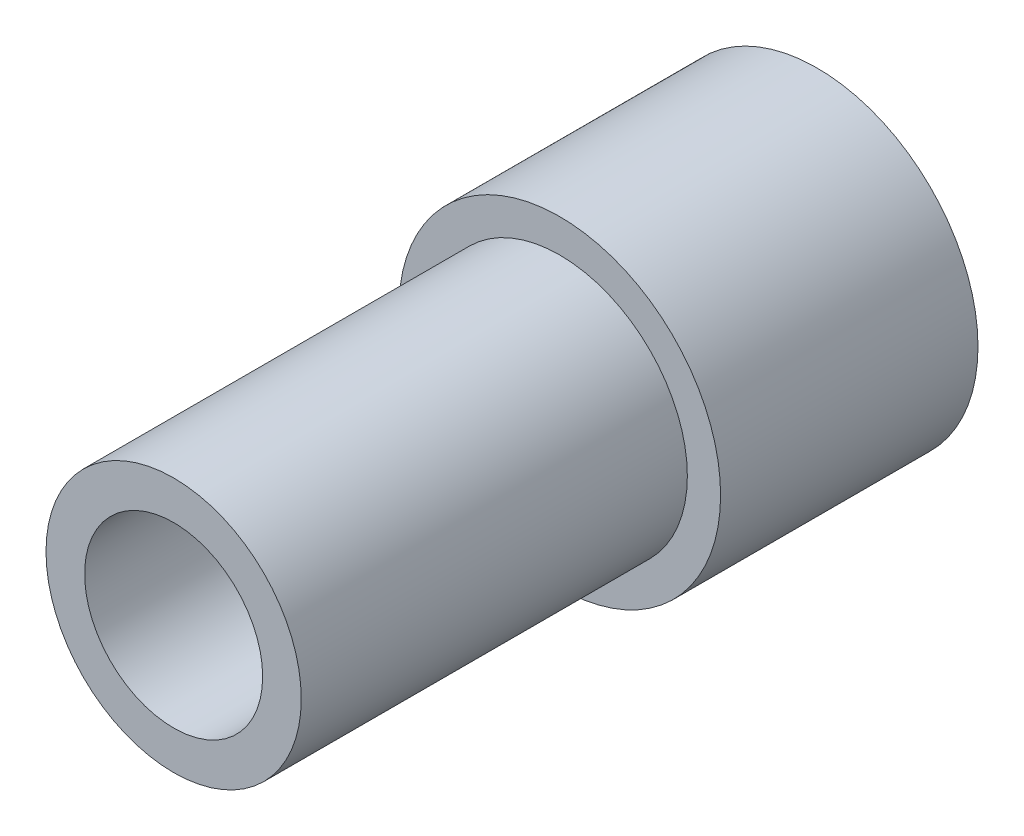
ISO-10303-21;
HEADER;
FILE_DESCRIPTION(('STEP AP214'),'2;1');
FILE_NAME('part.step','',(''),(''),'','','');
FILE_SCHEMA(('AUTOMOTIVE_DESIGN { 1 0 10303 214 1 1 1 1 }'));
ENDSEC;
DATA;
#1=APPLICATION_CONTEXT('core data for automotive mechanical design processes');
#2=APPLICATION_PROTOCOL_DEFINITION('international standard','automotive_design',2000,#1);
#3=PRODUCT_CONTEXT('',#1,'mechanical');
#4=PRODUCT('Part','Part','',(#3));
#5=PRODUCT_RELATED_PRODUCT_CATEGORY('part','',(#4));
#6=PRODUCT_DEFINITION_FORMATION('','',#4);
#7=PRODUCT_DEFINITION_CONTEXT('part definition',#1,'design');
#8=PRODUCT_DEFINITION('design','',#6,#7);
#9=PRODUCT_DEFINITION_SHAPE('','',#8);
#10=(LENGTH_UNIT() NAMED_UNIT(*) SI_UNIT(.MILLI.,.METRE.));
#11=(NAMED_UNIT(*) PLANE_ANGLE_UNIT() SI_UNIT($,.RADIAN.));
#12=(NAMED_UNIT(*) SI_UNIT($,.STERADIAN.) SOLID_ANGLE_UNIT());
#13=UNCERTAINTY_MEASURE_WITH_UNIT(LENGTH_MEASURE(1.E-05),#10,'distance_accuracy_value','');
#14=(GEOMETRIC_REPRESENTATION_CONTEXT(3) GLOBAL_UNCERTAINTY_ASSIGNED_CONTEXT((#13)) GLOBAL_UNIT_ASSIGNED_CONTEXT((#10,
#11,#12)) REPRESENTATION_CONTEXT('',''));
#15=CARTESIAN_POINT('',(0.,0.,0.));
#16=DIRECTION('',(0.,0.,1.));
#17=DIRECTION('',(1.,0.,0.));
#18=AXIS2_PLACEMENT_3D('',#15,#16,#17);
#19=CARTESIAN_POINT('',(0.,0.,30.));
#20=DIRECTION('',(0.,0.,1.));
#21=DIRECTION('',(1.,0.,0.));
#22=AXIS2_PLACEMENT_3D('',#19,#20,#21);
#23=PLANE('',#22);
#24=CARTESIAN_POINT('',(0.,0.,30.));
#25=DIRECTION('',(0.,0.,1.));
#26=DIRECTION('',(1.,0.,0.));
#27=AXIS2_PLACEMENT_3D('',#24,#25,#26);
#28=CIRCLE('',#27,4.15);
#29=CARTESIAN_POINT('',(4.15,0.,30.));
#30=VERTEX_POINT('',#29);
#31=EDGE_CURVE('E38',#30,#30,#28,.T.);
#32=ORIENTED_EDGE('',*,*,#31,.F.);
#33=EDGE_LOOP('',(#32));
#34=FACE_BOUND('',#33,.T.);
#35=CARTESIAN_POINT('',(0.,0.,30.));
#36=DIRECTION('',(0.,0.,1.));
#37=DIRECTION('',(1.,0.,0.));
#38=AXIS2_PLACEMENT_3D('',#35,#36,#37);
#39=CIRCLE('',#38,5.95);
#40=CARTESIAN_POINT('',(5.95,0.,30.));
#41=VERTEX_POINT('',#40);
#42=EDGE_CURVE('E52',#41,#41,#39,.T.);
#43=ORIENTED_EDGE('',*,*,#42,.T.);
#44=EDGE_LOOP('',(#43));
#45=FACE_BOUND('',#44,.T.);
#46=ADVANCED_FACE('F31',(#34,#45),#23,.T.);
#47=CARTESIAN_POINT('',(0.,0.,30.));
#48=DIRECTION('',(0.,0.,-1.));
#49=DIRECTION('',(-1.,0.,0.));
#50=AXIS2_PLACEMENT_3D('',#47,#48,#49);
#51=CYLINDRICAL_SURFACE('',#50,7.5);
#52=CARTESIAN_POINT('',(0.,0.,0.));
#53=DIRECTION('',(0.,0.,1.));
#54=DIRECTION('',(1.,0.,0.));
#55=AXIS2_PLACEMENT_3D('',#52,#53,#54);
#56=CIRCLE('',#55,7.5);
#57=CARTESIAN_POINT('',(7.5,0.,0.));
#58=VERTEX_POINT('',#57);
#59=EDGE_CURVE('E10',#58,#58,#56,.T.);
#60=ORIENTED_EDGE('',*,*,#59,.T.);
#61=EDGE_LOOP('',(#60));
#62=FACE_BOUND('',#61,.T.);
#63=CARTESIAN_POINT('',(0.,0.,12.));
#64=DIRECTION('',(0.,0.,1.));
#65=DIRECTION('',(1.,0.,0.));
#66=AXIS2_PLACEMENT_3D('',#63,#64,#65);
#67=CIRCLE('',#66,7.5);
#68=CARTESIAN_POINT('',(7.5,0.,12.));
#69=VERTEX_POINT('',#68);
#70=EDGE_CURVE('E47',#69,#69,#67,.T.);
#71=ORIENTED_EDGE('',*,*,#70,.F.);
#72=EDGE_LOOP('',(#71));
#73=FACE_BOUND('',#72,.T.);
#74=ADVANCED_FACE('F33',(#62,#73),#51,.T.);
#75=CARTESIAN_POINT('',(0.,0.,0.));
#76=DIRECTION('',(0.,0.,1.));
#77=DIRECTION('',(1.,0.,0.));
#78=AXIS2_PLACEMENT_3D('',#75,#76,#77);
#79=PLANE('',#78);
#80=ORIENTED_EDGE('',*,*,#59,.F.);
#81=EDGE_LOOP('',(#80));
#82=FACE_BOUND('',#81,.T.);
#83=CARTESIAN_POINT('',(0.,0.,0.));
#84=DIRECTION('',(0.,0.,1.));
#85=DIRECTION('',(1.,0.,0.));
#86=AXIS2_PLACEMENT_3D('',#83,#84,#85);
#87=CIRCLE('',#86,4.15);
#88=CARTESIAN_POINT('',(4.15,0.,0.));
#89=VERTEX_POINT('',#88);
#90=EDGE_CURVE('E42',#89,#89,#87,.T.);
#91=ORIENTED_EDGE('',*,*,#90,.T.);
#92=EDGE_LOOP('',(#91));
#93=FACE_BOUND('',#92,.T.);
#94=ADVANCED_FACE('F69',(#82,#93),#79,.F.);
#95=CARTESIAN_POINT('',(0.,0.,30.));
#96=DIRECTION('',(0.,0.,-1.));
#97=DIRECTION('',(-1.,0.,0.));
#98=AXIS2_PLACEMENT_3D('',#95,#96,#97);
#99=CYLINDRICAL_SURFACE('',#98,4.15);
#100=ORIENTED_EDGE('',*,*,#31,.T.);
#101=EDGE_LOOP('',(#100));
#102=FACE_BOUND('',#101,.T.);
#103=ORIENTED_EDGE('',*,*,#90,.F.);
#104=EDGE_LOOP('',(#103));
#105=FACE_BOUND('',#104,.T.);
#106=ADVANCED_FACE('F64',(#102,#105),#99,.F.);
#107=CARTESIAN_POINT('',(0.,0.,12.));
#108=DIRECTION('',(0.,0.,1.));
#109=DIRECTION('',(1.,0.,0.));
#110=AXIS2_PLACEMENT_3D('',#107,#108,#109);
#111=PLANE('',#110);
#112=CARTESIAN_POINT('',(0.,0.,12.));
#113=DIRECTION('',(0.,0.,1.));
#114=DIRECTION('',(1.,0.,0.));
#115=AXIS2_PLACEMENT_3D('',#112,#113,#114);
#116=CIRCLE('',#115,5.95);
#117=CARTESIAN_POINT('',(5.95,0.,12.));
#118=VERTEX_POINT('',#117);
#119=EDGE_CURVE('E51',#118,#118,#116,.T.);
#120=ORIENTED_EDGE('',*,*,#119,.F.);
#121=EDGE_LOOP('',(#120));
#122=FACE_BOUND('',#121,.T.);
#123=ORIENTED_EDGE('',*,*,#70,.T.);
#124=EDGE_LOOP('',(#123));
#125=FACE_BOUND('',#124,.T.);
#126=ADVANCED_FACE('F61',(#122,#125),#111,.T.);
#127=CARTESIAN_POINT('',(0.,0.,12.));
#128=DIRECTION('',(0.,0.,1.));
#129=DIRECTION('',(1.,0.,0.));
#130=AXIS2_PLACEMENT_3D('',#127,#128,#129);
#131=CYLINDRICAL_SURFACE('',#130,5.95);
#132=ORIENTED_EDGE('',*,*,#119,.T.);
#133=EDGE_LOOP('',(#132));
#134=FACE_BOUND('',#133,.T.);
#135=ORIENTED_EDGE('',*,*,#42,.F.);
#136=EDGE_LOOP('',(#135));
#137=FACE_BOUND('',#136,.T.);
#138=ADVANCED_FACE('F58',(#134,#137),#131,.T.);
#139=CLOSED_SHELL('',(#46,#74,#94,#106,#126,#138));
#140=MANIFOLD_SOLID_BREP('B2',#139);
#141=ADVANCED_BREP_SHAPE_REPRESENTATION('',(#18,#140),#14);
#142=SHAPE_DEFINITION_REPRESENTATION(#9,#141);
ENDSEC;
END-ISO-10303-21;
